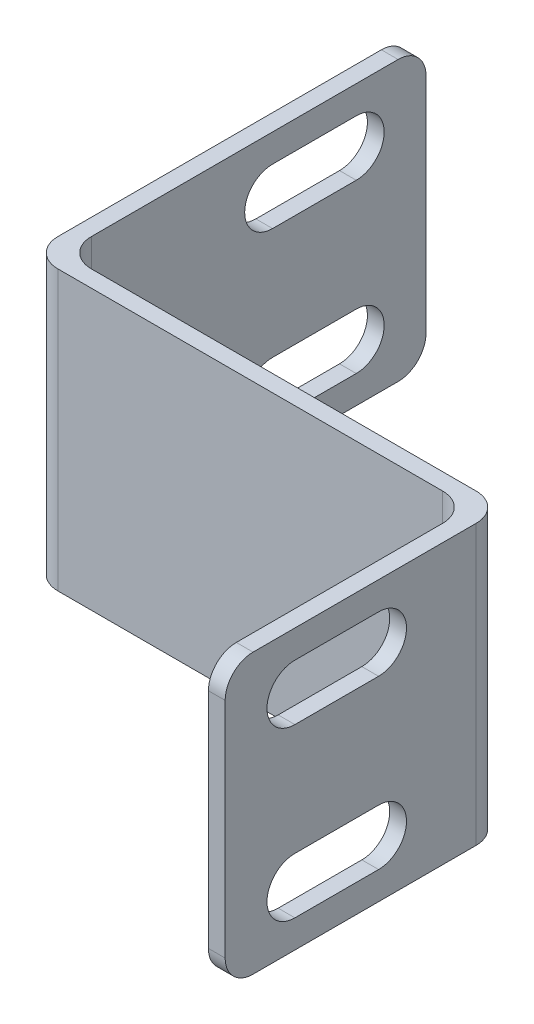
ISO-10303-21;
HEADER;
FILE_DESCRIPTION(('STEP AP214'),'2;1');
FILE_NAME('part.step','',(''),(''),'','','');
FILE_SCHEMA(('AUTOMOTIVE_DESIGN { 1 0 10303 214 1 1 1 1 }'));
ENDSEC;
DATA;
#1=APPLICATION_CONTEXT('core data for automotive mechanical design processes');
#2=APPLICATION_PROTOCOL_DEFINITION('international standard','automotive_design',2000,#1);
#3=PRODUCT_CONTEXT('',#1,'mechanical');
#4=PRODUCT('Part','Part','',(#3));
#5=PRODUCT_RELATED_PRODUCT_CATEGORY('part','',(#4));
#6=PRODUCT_DEFINITION_FORMATION('','',#4);
#7=PRODUCT_DEFINITION_CONTEXT('part definition',#1,'design');
#8=PRODUCT_DEFINITION('design','',#6,#7);
#9=PRODUCT_DEFINITION_SHAPE('','',#8);
#10=(LENGTH_UNIT() NAMED_UNIT(*) SI_UNIT(.MILLI.,.METRE.));
#11=(NAMED_UNIT(*) PLANE_ANGLE_UNIT() SI_UNIT($,.RADIAN.));
#12=(NAMED_UNIT(*) SI_UNIT($,.STERADIAN.) SOLID_ANGLE_UNIT());
#13=UNCERTAINTY_MEASURE_WITH_UNIT(LENGTH_MEASURE(1.E-05),#10,'distance_accuracy_value','');
#14=(GEOMETRIC_REPRESENTATION_CONTEXT(3) GLOBAL_UNCERTAINTY_ASSIGNED_CONTEXT((#13)) GLOBAL_UNIT_ASSIGNED_CONTEXT((#10,
#11,#12)) REPRESENTATION_CONTEXT('',''));
#15=CARTESIAN_POINT('',(0.,0.,0.));
#16=DIRECTION('',(0.,0.,1.));
#17=DIRECTION('',(1.,0.,0.));
#18=AXIS2_PLACEMENT_3D('',#15,#16,#17);
#19=CARTESIAN_POINT('',(0.,50.,0.));
#20=DIRECTION('',(0.,0.,1.));
#21=DIRECTION('',(1.,0.,0.));
#22=AXIS2_PLACEMENT_3D('',#19,#20,#21);
#23=PLANE('',#22);
#24=DIRECTION('',(0.,-1.,0.));
#25=VECTOR('',#24,1.);
#26=CARTESIAN_POINT('',(0.,50.,0.));
#27=LINE('',#26,#25);
#28=CARTESIAN_POINT('',(0.,45.,0.));
#29=VERTEX_POINT('',#28);
#30=CARTESIAN_POINT('',(0.,5.,0.));
#31=VERTEX_POINT('',#30);
#32=EDGE_CURVE('E389',#29,#31,#27,.T.);
#33=ORIENTED_EDGE('',*,*,#32,.T.);
#34=DIRECTION('',(-1.,0.,0.));
#35=VECTOR('',#34,1.);
#36=CARTESIAN_POINT('',(0.,5.,0.));
#37=LINE('',#36,#35);
#38=CARTESIAN_POINT('',(-3.,5.,0.));
#39=VERTEX_POINT('',#38);
#40=EDGE_CURVE('E477',#31,#39,#37,.T.);
#41=ORIENTED_EDGE('',*,*,#40,.T.);
#42=DIRECTION('',(0.,-1.,0.));
#43=VECTOR('',#42,1.);
#44=CARTESIAN_POINT('',(-3.,50.,0.));
#45=LINE('',#44,#43);
#46=CARTESIAN_POINT('',(-3.,45.,0.));
#47=VERTEX_POINT('',#46);
#48=EDGE_CURVE('E410',#47,#39,#45,.T.);
#49=ORIENTED_EDGE('',*,*,#48,.F.);
#50=DIRECTION('',(-1.,0.,0.));
#51=VECTOR('',#50,1.);
#52=CARTESIAN_POINT('',(0.,45.,0.));
#53=LINE('',#52,#51);
#54=EDGE_CURVE('E57',#47,#29,#53,.F.);
#55=ORIENTED_EDGE('',*,*,#54,.T.);
#56=EDGE_LOOP('',(#33,#41,#49,#55));
#57=FACE_BOUND('',#56,.T.);
#58=ADVANCED_FACE('F37',(#57),#23,.F.);
#59=CARTESIAN_POINT('',(-3.,50.,0.));
#60=DIRECTION('',(1.,0.,0.));
#61=DIRECTION('',(0.,0.,-1.));
#62=AXIS2_PLACEMENT_3D('',#59,#60,#61);
#63=PLANE('',#62);
#64=DIRECTION('',(0.,0.,1.));
#65=VECTOR('',#64,1.);
#66=CARTESIAN_POINT('',(-3.,35.,12.5));
#67=LINE('',#66,#65);
#68=CARTESIAN_POINT('',(-3.,35.,12.5));
#69=VERTEX_POINT('',#68);
#70=CARTESIAN_POINT('',(-3.,35.,27.5));
#71=VERTEX_POINT('',#70);
#72=EDGE_CURVE('E262',#69,#71,#67,.T.);
#73=ORIENTED_EDGE('',*,*,#72,.F.);
#74=CARTESIAN_POINT('',(-3.,40.,12.5));
#75=DIRECTION('',(-1.,0.,0.));
#76=DIRECTION('',(0.,0.,1.));
#77=AXIS2_PLACEMENT_3D('',#74,#75,#76);
#78=CIRCLE('',#77,4.99999999999999);
#79=CARTESIAN_POINT('',(-3.,45.,12.5));
#80=VERTEX_POINT('',#79);
#81=EDGE_CURVE('E267',#80,#69,#78,.T.);
#82=ORIENTED_EDGE('',*,*,#81,.F.);
#83=DIRECTION('',(0.,0.,-1.));
#84=VECTOR('',#83,1.);
#85=CARTESIAN_POINT('',(-3.,45.,12.5));
#86=LINE('',#85,#84);
#87=CARTESIAN_POINT('',(-3.,45.,27.5));
#88=VERTEX_POINT('',#87);
#89=EDGE_CURVE('E272',#88,#80,#86,.T.);
#90=ORIENTED_EDGE('',*,*,#89,.F.);
#91=CARTESIAN_POINT('',(-3.,40.,27.5));
#92=DIRECTION('',(-1.,0.,0.));
#93=DIRECTION('',(0.,0.,1.));
#94=AXIS2_PLACEMENT_3D('',#91,#92,#93);
#95=CIRCLE('',#94,4.99999999999999);
#96=EDGE_CURVE('E251',#71,#88,#95,.T.);
#97=ORIENTED_EDGE('',*,*,#96,.F.);
#98=EDGE_LOOP('',(#73,#82,#90,#97));
#99=FACE_BOUND('',#98,.T.);
#100=DIRECTION('',(0.,0.,1.));
#101=VECTOR('',#100,1.);
#102=CARTESIAN_POINT('',(-3.,5.00000000000002,12.5000000000003));
#103=LINE('',#102,#101);
#104=CARTESIAN_POINT('',(-3.,5.00000000000002,12.5000000000003));
#105=VERTEX_POINT('',#104);
#106=CARTESIAN_POINT('',(-3.,5.00000000000002,27.5000000000003));
#107=VERTEX_POINT('',#106);
#108=EDGE_CURVE('E296',#105,#107,#103,.T.);
#109=ORIENTED_EDGE('',*,*,#108,.F.);
#110=CARTESIAN_POINT('',(-3.,10.,12.5000000000003));
#111=DIRECTION('',(-1.,0.,0.));
#112=DIRECTION('',(0.,0.,1.));
#113=AXIS2_PLACEMENT_3D('',#110,#111,#112);
#114=CIRCLE('',#113,4.99999999999999);
#115=CARTESIAN_POINT('',(-3.,15.,12.5000000000003));
#116=VERTEX_POINT('',#115);
#117=EDGE_CURVE('E294',#116,#105,#114,.T.);
#118=ORIENTED_EDGE('',*,*,#117,.F.);
#119=DIRECTION('',(0.,0.,-1.));
#120=VECTOR('',#119,1.);
#121=CARTESIAN_POINT('',(-3.,15.,12.5000000000003));
#122=LINE('',#121,#120);
#123=CARTESIAN_POINT('',(-3.,15.,27.5000000000003));
#124=VERTEX_POINT('',#123);
#125=EDGE_CURVE('E302',#124,#116,#122,.T.);
#126=ORIENTED_EDGE('',*,*,#125,.F.);
#127=CARTESIAN_POINT('',(-3.,10.,27.5000000000003));
#128=DIRECTION('',(-1.,0.,0.));
#129=DIRECTION('',(0.,0.,1.));
#130=AXIS2_PLACEMENT_3D('',#127,#128,#129);
#131=CIRCLE('',#130,4.99999999999999);
#132=EDGE_CURVE('E299',#107,#124,#131,.T.);
#133=ORIENTED_EDGE('',*,*,#132,.F.);
#134=EDGE_LOOP('',(#109,#118,#126,#133));
#135=FACE_BOUND('',#134,.T.);
#136=ORIENTED_EDGE('',*,*,#48,.T.);
#137=CARTESIAN_POINT('',(-3.,5.,5.));
#138=DIRECTION('',(1.,0.,0.));
#139=DIRECTION('',(0.,0.,-1.));
#140=AXIS2_PLACEMENT_3D('',#137,#138,#139);
#141=CIRCLE('',#140,5.);
#142=CARTESIAN_POINT('',(-3.,0.,5.));
#143=VERTEX_POINT('',#142);
#144=EDGE_CURVE('E482',#39,#143,#141,.F.);
#145=ORIENTED_EDGE('',*,*,#144,.T.);
#146=DIRECTION('',(0.,0.,1.));
#147=VECTOR('',#146,1.);
#148=CARTESIAN_POINT('',(-3.,0.,0.));
#149=LINE('',#148,#147);
#150=CARTESIAN_POINT('',(-3.,0.,63.));
#151=VERTEX_POINT('',#150);
#152=EDGE_CURVE('E344',#143,#151,#149,.T.);
#153=ORIENTED_EDGE('',*,*,#152,.T.);
#154=DIRECTION('',(0.,-1.,0.));
#155=VECTOR('',#154,1.);
#156=CARTESIAN_POINT('',(-3.,50.,63.));
#157=LINE('',#156,#155);
#158=CARTESIAN_POINT('',(-3.,50.,63.));
#159=VERTEX_POINT('',#158);
#160=EDGE_CURVE('E439',#151,#159,#157,.F.);
#161=ORIENTED_EDGE('',*,*,#160,.T.);
#162=DIRECTION('',(0.,0.,1.));
#163=VECTOR('',#162,1.);
#164=CARTESIAN_POINT('',(-3.,50.,0.));
#165=LINE('',#164,#163);
#166=CARTESIAN_POINT('',(-3.,50.,5.));
#167=VERTEX_POINT('',#166);
#168=EDGE_CURVE('E372',#167,#159,#165,.T.);
#169=ORIENTED_EDGE('',*,*,#168,.F.);
#170=CARTESIAN_POINT('',(-3.,45.,5.));
#171=DIRECTION('',(1.,0.,0.));
#172=DIRECTION('',(0.,0.,-1.));
#173=AXIS2_PLACEMENT_3D('',#170,#171,#172);
#174=CIRCLE('',#173,5.);
#175=EDGE_CURVE('E480',#167,#47,#174,.F.);
#176=ORIENTED_EDGE('',*,*,#175,.T.);
#177=EDGE_LOOP('',(#136,#145,#153,#161,#169,#176));
#178=FACE_BOUND('',#177,.T.);
#179=ADVANCED_FACE('F269',(#99,#135,#178),#63,.F.);
#180=CARTESIAN_POINT('',(-3.,50.,68.));
#181=DIRECTION('',(0.,0.,-1.));
#182=DIRECTION('',(-1.,0.,0.));
#183=AXIS2_PLACEMENT_3D('',#180,#181,#182);
#184=PLANE('',#183);
#185=DIRECTION('',(1.,0.,0.));
#186=VECTOR('',#185,1.);
#187=CARTESIAN_POINT('',(-3.,0.,68.));
#188=LINE('',#187,#186);
#189=CARTESIAN_POINT('',(2.,0.,68.));
#190=VERTEX_POINT('',#189);
#191=CARTESIAN_POINT('',(71.,0.,68.));
#192=VERTEX_POINT('',#191);
#193=EDGE_CURVE('E391',#190,#192,#188,.T.);
#194=ORIENTED_EDGE('',*,*,#193,.T.);
#195=DIRECTION('',(0.,-1.,0.));
#196=VECTOR('',#195,1.);
#197=CARTESIAN_POINT('',(71.,50.,68.));
#198=LINE('',#197,#196);
#199=CARTESIAN_POINT('',(71.,50.,68.));
#200=VERTEX_POINT('',#199);
#201=EDGE_CURVE('E437',#192,#200,#198,.F.);
#202=ORIENTED_EDGE('',*,*,#201,.T.);
#203=DIRECTION('',(1.,0.,0.));
#204=VECTOR('',#203,1.);
#205=CARTESIAN_POINT('',(-3.,50.,68.));
#206=LINE('',#205,#204);
#207=CARTESIAN_POINT('',(2.,50.,68.));
#208=VERTEX_POINT('',#207);
#209=EDGE_CURVE('E374',#208,#200,#206,.T.);
#210=ORIENTED_EDGE('',*,*,#209,.F.);
#211=DIRECTION('',(0.,-1.,0.));
#212=VECTOR('',#211,1.);
#213=CARTESIAN_POINT('',(2.,50.,68.));
#214=LINE('',#213,#212);
#215=EDGE_CURVE('E434',#208,#190,#214,.T.);
#216=ORIENTED_EDGE('',*,*,#215,.T.);
#217=EDGE_LOOP('',(#194,#202,#210,#216));
#218=FACE_BOUND('',#217,.T.);
#219=ADVANCED_FACE('F512',(#218),#184,.F.);
#220=CARTESIAN_POINT('',(76.,50.,68.));
#221=DIRECTION('',(1.,0.,0.));
#222=DIRECTION('',(0.,0.,-1.));
#223=AXIS2_PLACEMENT_3D('',#220,#221,#222);
#224=PLANE('',#223);
#225=DIRECTION('',(0.,0.,1.));
#226=VECTOR('',#225,1.);
#227=CARTESIAN_POINT('',(76.,35.,87.5));
#228=LINE('',#227,#226);
#229=CARTESIAN_POINT('',(76.,35.,87.5));
#230=VERTEX_POINT('',#229);
#231=CARTESIAN_POINT('',(76.,35.,102.5));
#232=VERTEX_POINT('',#231);
#233=EDGE_CURVE('E325',#230,#232,#228,.T.);
#234=ORIENTED_EDGE('',*,*,#233,.F.);
#235=CARTESIAN_POINT('',(76.,40.,87.5));
#236=DIRECTION('',(-1.,0.,0.));
#237=DIRECTION('',(0.,0.,1.));
#238=AXIS2_PLACEMENT_3D('',#235,#236,#237);
#239=CIRCLE('',#238,5.);
#240=CARTESIAN_POINT('',(76.,45.,87.5));
#241=VERTEX_POINT('',#240);
#242=EDGE_CURVE('E323',#241,#230,#239,.T.);
#243=ORIENTED_EDGE('',*,*,#242,.F.);
#244=DIRECTION('',(0.,0.,-1.));
#245=VECTOR('',#244,1.);
#246=CARTESIAN_POINT('',(76.,45.,87.5));
#247=LINE('',#246,#245);
#248=CARTESIAN_POINT('',(76.,45.,102.5));
#249=VERTEX_POINT('',#248);
#250=EDGE_CURVE('E332',#249,#241,#247,.T.);
#251=ORIENTED_EDGE('',*,*,#250,.F.);
#252=CARTESIAN_POINT('',(76.,40.,102.5));
#253=DIRECTION('',(-1.,0.,0.));
#254=DIRECTION('',(0.,0.,1.));
#255=AXIS2_PLACEMENT_3D('',#252,#253,#254);
#256=CIRCLE('',#255,5.);
#257=EDGE_CURVE('E329',#232,#249,#256,.T.);
#258=ORIENTED_EDGE('',*,*,#257,.F.);
#259=EDGE_LOOP('',(#234,#243,#251,#258));
#260=FACE_BOUND('',#259,.T.);
#261=DIRECTION('',(0.,0.,1.));
#262=VECTOR('',#261,1.);
#263=CARTESIAN_POINT('',(76.,5.00000000000001,87.5000000000003));
#264=LINE('',#263,#262);
#265=CARTESIAN_POINT('',(76.,5.00000000000001,87.5000000000003));
#266=VERTEX_POINT('',#265);
#267=CARTESIAN_POINT('',(76.,5.00000000000001,102.5));
#268=VERTEX_POINT('',#267);
#269=EDGE_CURVE('E354',#266,#268,#264,.T.);
#270=ORIENTED_EDGE('',*,*,#269,.F.);
#271=CARTESIAN_POINT('',(76.,10.,87.5000000000003));
#272=DIRECTION('',(-1.,0.,0.));
#273=DIRECTION('',(0.,0.,1.));
#274=AXIS2_PLACEMENT_3D('',#271,#272,#273);
#275=CIRCLE('',#274,5.);
#276=CARTESIAN_POINT('',(76.,15.,87.5000000000003));
#277=VERTEX_POINT('',#276);
#278=EDGE_CURVE('E283',#277,#266,#275,.T.);
#279=ORIENTED_EDGE('',*,*,#278,.F.);
#280=DIRECTION('',(0.,0.,-1.));
#281=VECTOR('',#280,1.);
#282=CARTESIAN_POINT('',(76.,15.,87.5000000000003));
#283=LINE('',#282,#281);
#284=CARTESIAN_POINT('',(76.,15.,102.5));
#285=VERTEX_POINT('',#284);
#286=EDGE_CURVE('E360',#285,#277,#283,.T.);
#287=ORIENTED_EDGE('',*,*,#286,.F.);
#288=CARTESIAN_POINT('',(76.,10.,102.5));
#289=DIRECTION('',(-1.,0.,0.));
#290=DIRECTION('',(0.,0.,1.));
#291=AXIS2_PLACEMENT_3D('',#288,#289,#290);
#292=CIRCLE('',#291,5.);
#293=EDGE_CURVE('E357',#268,#285,#292,.T.);
#294=ORIENTED_EDGE('',*,*,#293,.F.);
#295=EDGE_LOOP('',(#270,#279,#287,#294));
#296=FACE_BOUND('',#295,.T.);
#297=DIRECTION('',(0.,0.,1.));
#298=VECTOR('',#297,1.);
#299=CARTESIAN_POINT('',(76.,0.,68.));
#300=LINE('',#299,#298);
#301=CARTESIAN_POINT('',(76.,0.,73.));
#302=VERTEX_POINT('',#301);
#303=CARTESIAN_POINT('',(76.,0.,110.));
#304=VERTEX_POINT('',#303);
#305=EDGE_CURVE('E394',#302,#304,#300,.T.);
#306=ORIENTED_EDGE('',*,*,#305,.T.);
#307=CARTESIAN_POINT('',(76.,5.,110.));
#308=DIRECTION('',(1.,0.,0.));
#309=DIRECTION('',(0.,0.,-1.));
#310=AXIS2_PLACEMENT_3D('',#307,#308,#309);
#311=CIRCLE('',#310,5.);
#312=CARTESIAN_POINT('',(76.,5.,115.));
#313=VERTEX_POINT('',#312);
#314=EDGE_CURVE('E468',#304,#313,#311,.F.);
#315=ORIENTED_EDGE('',*,*,#314,.T.);
#316=DIRECTION('',(0.,-1.,0.));
#317=VECTOR('',#316,1.);
#318=CARTESIAN_POINT('',(76.,50.,115.));
#319=LINE('',#318,#317);
#320=CARTESIAN_POINT('',(76.,45.,115.));
#321=VERTEX_POINT('',#320);
#322=EDGE_CURVE('E407',#321,#313,#319,.T.);
#323=ORIENTED_EDGE('',*,*,#322,.F.);
#324=CARTESIAN_POINT('',(76.,45.,110.));
#325=DIRECTION('',(1.,0.,0.));
#326=DIRECTION('',(0.,0.,-1.));
#327=AXIS2_PLACEMENT_3D('',#324,#325,#326);
#328=CIRCLE('',#327,5.);
#329=CARTESIAN_POINT('',(76.,50.,110.));
#330=VERTEX_POINT('',#329);
#331=EDGE_CURVE('E466',#321,#330,#328,.F.);
#332=ORIENTED_EDGE('',*,*,#331,.T.);
#333=DIRECTION('',(0.,0.,1.));
#334=VECTOR('',#333,1.);
#335=CARTESIAN_POINT('',(76.,50.,68.));
#336=LINE('',#335,#334);
#337=CARTESIAN_POINT('',(76.,50.,73.));
#338=VERTEX_POINT('',#337);
#339=EDGE_CURVE('E378',#338,#330,#336,.T.);
#340=ORIENTED_EDGE('',*,*,#339,.F.);
#341=DIRECTION('',(0.,-1.,0.));
#342=VECTOR('',#341,1.);
#343=CARTESIAN_POINT('',(76.,0.,73.));
#344=LINE('',#343,#342);
#345=EDGE_CURVE('E431',#338,#302,#344,.T.);
#346=ORIENTED_EDGE('',*,*,#345,.T.);
#347=EDGE_LOOP('',(#306,#315,#323,#332,#340,#346));
#348=FACE_BOUND('',#347,.T.);
#349=ADVANCED_FACE('F520',(#260,#296,#348),#224,.F.);
#350=CARTESIAN_POINT('',(76.,50.,115.));
#351=DIRECTION('',(0.,0.,-1.));
#352=DIRECTION('',(-1.,0.,0.));
#353=AXIS2_PLACEMENT_3D('',#350,#351,#352);
#354=PLANE('',#353);
#355=ORIENTED_EDGE('',*,*,#322,.T.);
#356=DIRECTION('',(1.,0.,0.));
#357=VECTOR('',#356,1.);
#358=CARTESIAN_POINT('',(76.,5.,115.));
#359=LINE('',#358,#357);
#360=CARTESIAN_POINT('',(79.,5.,115.));
#361=VERTEX_POINT('',#360);
#362=EDGE_CURVE('E455',#313,#361,#359,.T.);
#363=ORIENTED_EDGE('',*,*,#362,.T.);
#364=DIRECTION('',(0.,-1.,0.));
#365=VECTOR('',#364,1.);
#366=CARTESIAN_POINT('',(79.,50.,115.));
#367=LINE('',#366,#365);
#368=CARTESIAN_POINT('',(79.,45.,115.));
#369=VERTEX_POINT('',#368);
#370=EDGE_CURVE('E404',#369,#361,#367,.T.);
#371=ORIENTED_EDGE('',*,*,#370,.F.);
#372=DIRECTION('',(1.,0.,0.));
#373=VECTOR('',#372,1.);
#374=CARTESIAN_POINT('',(76.,45.,115.));
#375=LINE('',#374,#373);
#376=EDGE_CURVE('E453',#369,#321,#375,.F.);
#377=ORIENTED_EDGE('',*,*,#376,.T.);
#378=EDGE_LOOP('',(#355,#363,#371,#377));
#379=FACE_BOUND('',#378,.T.);
#380=ADVANCED_FACE('F549',(#379),#354,.F.);
#381=CARTESIAN_POINT('',(79.,50.,65.));
#382=DIRECTION('',(-1.,0.,0.));
#383=DIRECTION('',(0.,0.,1.));
#384=AXIS2_PLACEMENT_3D('',#381,#382,#383);
#385=PLANE('',#384);
#386=DIRECTION('',(0.,0.,1.));
#387=VECTOR('',#386,1.);
#388=CARTESIAN_POINT('',(79.,45.,87.5));
#389=LINE('',#388,#387);
#390=CARTESIAN_POINT('',(79.,45.,87.5));
#391=VERTEX_POINT('',#390);
#392=CARTESIAN_POINT('',(79.,45.,102.5));
#393=VERTEX_POINT('',#392);
#394=EDGE_CURVE('E317',#391,#393,#389,.T.);
#395=ORIENTED_EDGE('',*,*,#394,.F.);
#396=CARTESIAN_POINT('',(79.,40.,87.5));
#397=DIRECTION('',(-1.,0.,0.));
#398=DIRECTION('',(0.,0.,1.));
#399=AXIS2_PLACEMENT_3D('',#396,#397,#398);
#400=CIRCLE('',#399,5.);
#401=CARTESIAN_POINT('',(79.,35.,87.5));
#402=VERTEX_POINT('',#401);
#403=EDGE_CURVE('E320',#402,#391,#400,.F.);
#404=ORIENTED_EDGE('',*,*,#403,.F.);
#405=DIRECTION('',(0.,0.,-1.));
#406=VECTOR('',#405,1.);
#407=CARTESIAN_POINT('',(79.,35.,87.5));
#408=LINE('',#407,#406);
#409=CARTESIAN_POINT('',(79.,35.,102.5));
#410=VERTEX_POINT('',#409);
#411=EDGE_CURVE('E322',#410,#402,#408,.T.);
#412=ORIENTED_EDGE('',*,*,#411,.F.);
#413=CARTESIAN_POINT('',(79.,40.,102.5));
#414=DIRECTION('',(-1.,0.,0.));
#415=DIRECTION('',(0.,0.,1.));
#416=AXIS2_PLACEMENT_3D('',#413,#414,#415);
#417=CIRCLE('',#416,5.);
#418=EDGE_CURVE('E314',#393,#410,#417,.F.);
#419=ORIENTED_EDGE('',*,*,#418,.F.);
#420=EDGE_LOOP('',(#395,#404,#412,#419));
#421=FACE_BOUND('',#420,.T.);
#422=DIRECTION('',(0.,0.,1.));
#423=VECTOR('',#422,1.);
#424=CARTESIAN_POINT('',(79.,15.,87.5000000000003));
#425=LINE('',#424,#423);
#426=CARTESIAN_POINT('',(79.,15.,87.5000000000003));
#427=VERTEX_POINT('',#426);
#428=CARTESIAN_POINT('',(79.,15.,102.5));
#429=VERTEX_POINT('',#428);
#430=EDGE_CURVE('E348',#427,#429,#425,.T.);
#431=ORIENTED_EDGE('',*,*,#430,.F.);
#432=CARTESIAN_POINT('',(79.,10.,87.5000000000003));
#433=DIRECTION('',(-1.,0.,0.));
#434=DIRECTION('',(0.,0.,1.));
#435=AXIS2_PLACEMENT_3D('',#432,#433,#434);
#436=CIRCLE('',#435,5.);
#437=CARTESIAN_POINT('',(79.,5.00000000000001,87.5000000000003));
#438=VERTEX_POINT('',#437);
#439=EDGE_CURVE('E351',#438,#427,#436,.F.);
#440=ORIENTED_EDGE('',*,*,#439,.F.);
#441=DIRECTION('',(0.,0.,-1.));
#442=VECTOR('',#441,1.);
#443=CARTESIAN_POINT('',(79.,5.00000000000001,87.5000000000003));
#444=LINE('',#443,#442);
#445=CARTESIAN_POINT('',(79.,5.00000000000001,102.5));
#446=VERTEX_POINT('',#445);
#447=EDGE_CURVE('E326',#446,#438,#444,.T.);
#448=ORIENTED_EDGE('',*,*,#447,.F.);
#449=CARTESIAN_POINT('',(79.,10.,102.5));
#450=DIRECTION('',(-1.,0.,0.));
#451=DIRECTION('',(0.,0.,1.));
#452=AXIS2_PLACEMENT_3D('',#449,#450,#451);
#453=CIRCLE('',#452,5.);
#454=EDGE_CURVE('E345',#429,#446,#453,.F.);
#455=ORIENTED_EDGE('',*,*,#454,.F.);
#456=EDGE_LOOP('',(#431,#440,#448,#455));
#457=FACE_BOUND('',#456,.T.);
#458=ORIENTED_EDGE('',*,*,#370,.T.);
#459=CARTESIAN_POINT('',(79.,5.,110.));
#460=DIRECTION('',(-1.,0.,0.));
#461=DIRECTION('',(0.,0.,1.));
#462=AXIS2_PLACEMENT_3D('',#459,#460,#461);
#463=CIRCLE('',#462,5.);
#464=CARTESIAN_POINT('',(79.,0.,110.));
#465=VERTEX_POINT('',#464);
#466=EDGE_CURVE('E460',#361,#465,#463,.F.);
#467=ORIENTED_EDGE('',*,*,#466,.T.);
#468=DIRECTION('',(0.,0.,-1.));
#469=VECTOR('',#468,1.);
#470=CARTESIAN_POINT('',(79.,0.,65.));
#471=LINE('',#470,#469);
#472=CARTESIAN_POINT('',(79.,0.,70.));
#473=VERTEX_POINT('',#472);
#474=EDGE_CURVE('E397',#465,#473,#471,.T.);
#475=ORIENTED_EDGE('',*,*,#474,.T.);
#476=DIRECTION('',(0.,-1.,0.));
#477=VECTOR('',#476,1.);
#478=CARTESIAN_POINT('',(79.,50.,70.));
#479=LINE('',#478,#477);
#480=CARTESIAN_POINT('',(79.,50.,70.));
#481=VERTEX_POINT('',#480);
#482=EDGE_CURVE('E424',#473,#481,#479,.F.);
#483=ORIENTED_EDGE('',*,*,#482,.T.);
#484=DIRECTION('',(0.,0.,-1.));
#485=VECTOR('',#484,1.);
#486=CARTESIAN_POINT('',(79.,50.,65.));
#487=LINE('',#486,#485);
#488=CARTESIAN_POINT('',(79.,50.,110.));
#489=VERTEX_POINT('',#488);
#490=EDGE_CURVE('E381',#489,#481,#487,.T.);
#491=ORIENTED_EDGE('',*,*,#490,.F.);
#492=CARTESIAN_POINT('',(79.,45.,110.));
#493=DIRECTION('',(-1.,0.,0.));
#494=DIRECTION('',(0.,0.,1.));
#495=AXIS2_PLACEMENT_3D('',#492,#493,#494);
#496=CIRCLE('',#495,5.);
#497=EDGE_CURVE('E458',#489,#369,#496,.F.);
#498=ORIENTED_EDGE('',*,*,#497,.T.);
#499=EDGE_LOOP('',(#458,#467,#475,#483,#491,#498));
#500=FACE_BOUND('',#499,.T.);
#501=ADVANCED_FACE('F529',(#421,#457,#500),#385,.F.);
#502=CARTESIAN_POINT('',(0.,50.,65.));
#503=DIRECTION('',(0.,0.,1.));
#504=DIRECTION('',(1.,0.,0.));
#505=AXIS2_PLACEMENT_3D('',#502,#503,#504);
#506=PLANE('',#505);
#507=DIRECTION('',(-1.,0.,0.));
#508=VECTOR('',#507,1.);
#509=CARTESIAN_POINT('',(0.,50.,65.));
#510=LINE('',#509,#508);
#511=CARTESIAN_POINT('',(74.,50.,65.));
#512=VERTEX_POINT('',#511);
#513=CARTESIAN_POINT('',(5.00000000000001,50.,65.));
#514=VERTEX_POINT('',#513);
#515=EDGE_CURVE('E383',#512,#514,#510,.T.);
#516=ORIENTED_EDGE('',*,*,#515,.F.);
#517=DIRECTION('',(0.,-1.,0.));
#518=VECTOR('',#517,1.);
#519=CARTESIAN_POINT('',(74.,50.,65.));
#520=LINE('',#519,#518);
#521=CARTESIAN_POINT('',(74.,0.,65.));
#522=VERTEX_POINT('',#521);
#523=EDGE_CURVE('E415',#512,#522,#520,.T.);
#524=ORIENTED_EDGE('',*,*,#523,.T.);
#525=DIRECTION('',(-1.,0.,0.));
#526=VECTOR('',#525,1.);
#527=CARTESIAN_POINT('',(0.,0.,65.));
#528=LINE('',#527,#526);
#529=CARTESIAN_POINT('',(5.00000000000001,0.,65.));
#530=VERTEX_POINT('',#529);
#531=EDGE_CURVE('E399',#522,#530,#528,.T.);
#532=ORIENTED_EDGE('',*,*,#531,.T.);
#533=DIRECTION('',(0.,-1.,0.));
#534=VECTOR('',#533,1.);
#535=CARTESIAN_POINT('',(5.00000000000001,50.,65.));
#536=LINE('',#535,#534);
#537=EDGE_CURVE('E413',#530,#514,#536,.F.);
#538=ORIENTED_EDGE('',*,*,#537,.T.);
#539=EDGE_LOOP('',(#516,#524,#532,#538));
#540=FACE_BOUND('',#539,.T.);
#541=ADVANCED_FACE('F538',(#540),#506,.F.);
#542=CARTESIAN_POINT('',(0.,50.,0.));
#543=DIRECTION('',(-1.,0.,0.));
#544=DIRECTION('',(0.,0.,1.));
#545=AXIS2_PLACEMENT_3D('',#542,#543,#544);
#546=PLANE('',#545);
#547=DIRECTION('',(0.,0.,1.));
#548=VECTOR('',#547,1.);
#549=CARTESIAN_POINT('',(0.,45.,12.5));
#550=LINE('',#549,#548);
#551=CARTESIAN_POINT('',(0.,45.,12.5));
#552=VERTEX_POINT('',#551);
#553=CARTESIAN_POINT('',(0.,45.,27.5));
#554=VERTEX_POINT('',#553);
#555=EDGE_CURVE('E890',#552,#554,#550,.T.);
#556=ORIENTED_EDGE('',*,*,#555,.F.);
#557=CARTESIAN_POINT('',(0.,40.,12.5));
#558=DIRECTION('',(-1.,0.,0.));
#559=DIRECTION('',(0.,0.,1.));
#560=AXIS2_PLACEMENT_3D('',#557,#558,#559);
#561=CIRCLE('',#560,4.99999999999999);
#562=CARTESIAN_POINT('',(0.,35.,12.5));
#563=VERTEX_POINT('',#562);
#564=EDGE_CURVE('E284',#563,#552,#561,.F.);
#565=ORIENTED_EDGE('',*,*,#564,.F.);
#566=DIRECTION('',(0.,0.,-1.));
#567=VECTOR('',#566,1.);
#568=CARTESIAN_POINT('',(0.,35.,12.5));
#569=LINE('',#568,#567);
#570=CARTESIAN_POINT('',(0.,35.,27.5));
#571=VERTEX_POINT('',#570);
#572=EDGE_CURVE('E281',#571,#563,#569,.T.);
#573=ORIENTED_EDGE('',*,*,#572,.F.);
#574=CARTESIAN_POINT('',(0.,40.,27.5));
#575=DIRECTION('',(-1.,0.,0.));
#576=DIRECTION('',(0.,0.,1.));
#577=AXIS2_PLACEMENT_3D('',#574,#575,#576);
#578=CIRCLE('',#577,4.99999999999999);
#579=EDGE_CURVE('E254',#554,#571,#578,.F.);
#580=ORIENTED_EDGE('',*,*,#579,.F.);
#581=EDGE_LOOP('',(#556,#565,#573,#580));
#582=FACE_BOUND('',#581,.T.);
#583=DIRECTION('',(0.,0.,1.));
#584=VECTOR('',#583,1.);
#585=CARTESIAN_POINT('',(0.,15.,12.5000000000003));
#586=LINE('',#585,#584);
#587=CARTESIAN_POINT('',(0.,15.,12.5000000000003));
#588=VERTEX_POINT('',#587);
#589=CARTESIAN_POINT('',(0.,15.,27.5000000000003));
#590=VERTEX_POINT('',#589);
#591=EDGE_CURVE('E288',#588,#590,#586,.T.);
#592=ORIENTED_EDGE('',*,*,#591,.F.);
#593=CARTESIAN_POINT('',(0.,10.,12.5000000000003));
#594=DIRECTION('',(-1.,0.,0.));
#595=DIRECTION('',(0.,0.,1.));
#596=AXIS2_PLACEMENT_3D('',#593,#594,#595);
#597=CIRCLE('',#596,4.99999999999999);
#598=CARTESIAN_POINT('',(0.,5.00000000000002,12.5000000000003));
#599=VERTEX_POINT('',#598);
#600=EDGE_CURVE('E291',#599,#588,#597,.F.);
#601=ORIENTED_EDGE('',*,*,#600,.F.);
#602=DIRECTION('',(0.,0.,-1.));
#603=VECTOR('',#602,1.);
#604=CARTESIAN_POINT('',(0.,5.00000000000002,12.5000000000003));
#605=LINE('',#604,#603);
#606=CARTESIAN_POINT('',(0.,5.00000000000002,27.5000000000003));
#607=VERTEX_POINT('',#606);
#608=EDGE_CURVE('E293',#607,#599,#605,.T.);
#609=ORIENTED_EDGE('',*,*,#608,.F.);
#610=CARTESIAN_POINT('',(0.,10.,27.5000000000003));
#611=DIRECTION('',(-1.,0.,0.));
#612=DIRECTION('',(0.,0.,1.));
#613=AXIS2_PLACEMENT_3D('',#610,#611,#612);
#614=CIRCLE('',#613,4.99999999999999);
#615=EDGE_CURVE('E285',#590,#607,#614,.F.);
#616=ORIENTED_EDGE('',*,*,#615,.F.);
#617=EDGE_LOOP('',(#592,#601,#609,#616));
#618=FACE_BOUND('',#617,.T.);
#619=DIRECTION('',(0.,0.,-1.));
#620=VECTOR('',#619,1.);
#621=CARTESIAN_POINT('',(0.,0.,0.));
#622=LINE('',#621,#620);
#623=CARTESIAN_POINT('',(0.,0.,60.));
#624=VERTEX_POINT('',#623);
#625=CARTESIAN_POINT('',(0.,0.,5.));
#626=VERTEX_POINT('',#625);
#627=EDGE_CURVE('E375',#624,#626,#622,.T.);
#628=ORIENTED_EDGE('',*,*,#627,.T.);
#629=CARTESIAN_POINT('',(0.,5.,5.));
#630=DIRECTION('',(-1.,0.,0.));
#631=DIRECTION('',(0.,0.,1.));
#632=AXIS2_PLACEMENT_3D('',#629,#630,#631);
#633=CIRCLE('',#632,5.);
#634=EDGE_CURVE('E11',#626,#31,#633,.F.);
#635=ORIENTED_EDGE('',*,*,#634,.T.);
#636=ORIENTED_EDGE('',*,*,#32,.F.);
#637=CARTESIAN_POINT('',(0.,45.,5.));
#638=DIRECTION('',(-1.,0.,0.));
#639=DIRECTION('',(0.,0.,1.));
#640=AXIS2_PLACEMENT_3D('',#637,#638,#639);
#641=CIRCLE('',#640,5.);
#642=CARTESIAN_POINT('',(0.,50.,5.));
#643=VERTEX_POINT('',#642);
#644=EDGE_CURVE('E45',#29,#643,#641,.F.);
#645=ORIENTED_EDGE('',*,*,#644,.T.);
#646=DIRECTION('',(0.,0.,-1.));
#647=VECTOR('',#646,1.);
#648=CARTESIAN_POINT('',(0.,50.,0.));
#649=LINE('',#648,#647);
#650=CARTESIAN_POINT('',(0.,50.,60.));
#651=VERTEX_POINT('',#650);
#652=EDGE_CURVE('E386',#651,#643,#649,.T.);
#653=ORIENTED_EDGE('',*,*,#652,.F.);
#654=DIRECTION('',(0.,-1.,0.));
#655=VECTOR('',#654,1.);
#656=CARTESIAN_POINT('',(0.,0.,60.));
#657=LINE('',#656,#655);
#658=EDGE_CURVE('E442',#651,#624,#657,.T.);
#659=ORIENTED_EDGE('',*,*,#658,.T.);
#660=EDGE_LOOP('',(#628,#635,#636,#645,#653,#659));
#661=FACE_BOUND('',#660,.T.);
#662=ADVANCED_FACE('F485',(#582,#618,#661),#546,.F.);
#663=CARTESIAN_POINT('',(0.,50.,0.));
#664=DIRECTION('',(0.,1.,0.));
#665=DIRECTION('',(0.,0.,1.));
#666=AXIS2_PLACEMENT_3D('',#663,#664,#665);
#667=PLANE('',#666);
#668=ORIENTED_EDGE('',*,*,#339,.T.);
#669=DIRECTION('',(1.,0.,0.));
#670=VECTOR('',#669,1.);
#671=CARTESIAN_POINT('',(79.,50.,110.));
#672=LINE('',#671,#670);
#673=EDGE_CURVE('E473',#330,#489,#672,.T.);
#674=ORIENTED_EDGE('',*,*,#673,.T.);
#675=ORIENTED_EDGE('',*,*,#490,.T.);
#676=CARTESIAN_POINT('',(74.,50.,70.));
#677=DIRECTION('',(0.,1.,0.));
#678=DIRECTION('',(0.,0.,1.));
#679=AXIS2_PLACEMENT_3D('',#676,#677,#678);
#680=CIRCLE('',#679,5.);
#681=EDGE_CURVE('E429',#481,#512,#680,.T.);
#682=ORIENTED_EDGE('',*,*,#681,.T.);
#683=ORIENTED_EDGE('',*,*,#515,.T.);
#684=CARTESIAN_POINT('',(5.00000000000001,50.,60.));
#685=DIRECTION('',(0.,1.,0.));
#686=DIRECTION('',(0.,0.,1.));
#687=AXIS2_PLACEMENT_3D('',#684,#685,#686);
#688=CIRCLE('',#687,5.);
#689=EDGE_CURVE('E451',#514,#651,#688,.F.);
#690=ORIENTED_EDGE('',*,*,#689,.T.);
#691=ORIENTED_EDGE('',*,*,#652,.T.);
#692=DIRECTION('',(-1.,0.,0.));
#693=VECTOR('',#692,1.);
#694=CARTESIAN_POINT('',(-3.,50.,5.));
#695=LINE('',#694,#693);
#696=EDGE_CURVE('E470',#643,#167,#695,.T.);
#697=ORIENTED_EDGE('',*,*,#696,.T.);
#698=ORIENTED_EDGE('',*,*,#168,.T.);
#699=CARTESIAN_POINT('',(2.,50.,63.));
#700=DIRECTION('',(0.,1.,0.));
#701=DIRECTION('',(0.,0.,1.));
#702=AXIS2_PLACEMENT_3D('',#699,#700,#701);
#703=CIRCLE('',#702,5.);
#704=EDGE_CURVE('E427',#159,#208,#703,.T.);
#705=ORIENTED_EDGE('',*,*,#704,.T.);
#706=ORIENTED_EDGE('',*,*,#209,.T.);
#707=CARTESIAN_POINT('',(71.,50.,73.));
#708=DIRECTION('',(0.,1.,0.));
#709=DIRECTION('',(0.,0.,1.));
#710=AXIS2_PLACEMENT_3D('',#707,#708,#709);
#711=CIRCLE('',#710,5.);
#712=EDGE_CURVE('E447',#200,#338,#711,.F.);
#713=ORIENTED_EDGE('',*,*,#712,.T.);
#714=EDGE_LOOP('',(#668,#674,#675,#682,#683,#690,#691,#697,#698,#705,#706,#713));
#715=FACE_BOUND('',#714,.T.);
#716=ADVANCED_FACE('F490',(#715),#667,.T.);
#717=CARTESIAN_POINT('',(0.,0.,0.));
#718=DIRECTION('',(0.,1.,0.));
#719=DIRECTION('',(0.,0.,1.));
#720=AXIS2_PLACEMENT_3D('',#717,#718,#719);
#721=PLANE('',#720);
#722=ORIENTED_EDGE('',*,*,#474,.F.);
#723=DIRECTION('',(1.,0.,0.));
#724=VECTOR('',#723,1.);
#725=CARTESIAN_POINT('',(0.,0.,110.));
#726=LINE('',#725,#724);
#727=EDGE_CURVE('E464',#465,#304,#726,.F.);
#728=ORIENTED_EDGE('',*,*,#727,.T.);
#729=ORIENTED_EDGE('',*,*,#305,.F.);
#730=CARTESIAN_POINT('',(71.,0.,73.));
#731=DIRECTION('',(0.,1.,0.));
#732=DIRECTION('',(0.,0.,1.));
#733=AXIS2_PLACEMENT_3D('',#730,#731,#732);
#734=CIRCLE('',#733,5.);
#735=EDGE_CURVE('E445',#302,#192,#734,.T.);
#736=ORIENTED_EDGE('',*,*,#735,.T.);
#737=ORIENTED_EDGE('',*,*,#193,.F.);
#738=CARTESIAN_POINT('',(2.,0.,63.));
#739=DIRECTION('',(0.,1.,0.));
#740=DIRECTION('',(0.,0.,1.));
#741=AXIS2_PLACEMENT_3D('',#738,#739,#740);
#742=CIRCLE('',#741,5.);
#743=EDGE_CURVE('E418',#190,#151,#742,.F.);
#744=ORIENTED_EDGE('',*,*,#743,.T.);
#745=ORIENTED_EDGE('',*,*,#152,.F.);
#746=DIRECTION('',(-1.,0.,0.));
#747=VECTOR('',#746,1.);
#748=CARTESIAN_POINT('',(0.,0.,5.));
#749=LINE('',#748,#747);
#750=EDGE_CURVE('E462',#143,#626,#749,.F.);
#751=ORIENTED_EDGE('',*,*,#750,.T.);
#752=ORIENTED_EDGE('',*,*,#627,.F.);
#753=CARTESIAN_POINT('',(5.00000000000001,0.,60.));
#754=DIRECTION('',(0.,1.,0.));
#755=DIRECTION('',(0.,0.,1.));
#756=AXIS2_PLACEMENT_3D('',#753,#754,#755);
#757=CIRCLE('',#756,5.);
#758=EDGE_CURVE('E449',#624,#530,#757,.T.);
#759=ORIENTED_EDGE('',*,*,#758,.T.);
#760=ORIENTED_EDGE('',*,*,#531,.F.);
#761=CARTESIAN_POINT('',(74.,0.,70.));
#762=DIRECTION('',(0.,1.,0.));
#763=DIRECTION('',(0.,0.,1.));
#764=AXIS2_PLACEMENT_3D('',#761,#762,#763);
#765=CIRCLE('',#764,5.);
#766=EDGE_CURVE('E421',#522,#473,#765,.F.);
#767=ORIENTED_EDGE('',*,*,#766,.T.);
#768=EDGE_LOOP('',(#722,#728,#729,#736,#737,#744,#745,#751,#752,#759,#760,#767));
#769=FACE_BOUND('',#768,.T.);
#770=ADVANCED_FACE('F501',(#769),#721,.F.);
#771=CARTESIAN_POINT('',(74.,50.,70.));
#772=DIRECTION('',(0.,-1.,0.));
#773=DIRECTION('',(0.,0.,-1.));
#774=AXIS2_PLACEMENT_3D('',#771,#772,#773);
#775=CYLINDRICAL_SURFACE('',#774,5.);
#776=ORIENTED_EDGE('',*,*,#681,.F.);
#777=ORIENTED_EDGE('',*,*,#482,.F.);
#778=ORIENTED_EDGE('',*,*,#766,.F.);
#779=ORIENTED_EDGE('',*,*,#523,.F.);
#780=EDGE_LOOP('',(#776,#777,#778,#779));
#781=FACE_BOUND('',#780,.T.);
#782=ADVANCED_FACE('F535',(#781),#775,.T.);
#783=CARTESIAN_POINT('',(71.,50.,73.));
#784=DIRECTION('',(0.,1.,0.));
#785=DIRECTION('',(0.,0.,1.));
#786=AXIS2_PLACEMENT_3D('',#783,#784,#785);
#787=CYLINDRICAL_SURFACE('',#786,5.);
#788=ORIENTED_EDGE('',*,*,#712,.F.);
#789=ORIENTED_EDGE('',*,*,#201,.F.);
#790=ORIENTED_EDGE('',*,*,#735,.F.);
#791=ORIENTED_EDGE('',*,*,#345,.F.);
#792=EDGE_LOOP('',(#788,#789,#790,#791));
#793=FACE_BOUND('',#792,.T.);
#794=ADVANCED_FACE('F515',(#793),#787,.F.);
#795=CARTESIAN_POINT('',(2.,50.,63.));
#796=DIRECTION('',(0.,-1.,0.));
#797=DIRECTION('',(0.,0.,-1.));
#798=AXIS2_PLACEMENT_3D('',#795,#796,#797);
#799=CYLINDRICAL_SURFACE('',#798,5.);
#800=ORIENTED_EDGE('',*,*,#704,.F.);
#801=ORIENTED_EDGE('',*,*,#160,.F.);
#802=ORIENTED_EDGE('',*,*,#743,.F.);
#803=ORIENTED_EDGE('',*,*,#215,.F.);
#804=EDGE_LOOP('',(#800,#801,#802,#803));
#805=FACE_BOUND('',#804,.T.);
#806=ADVANCED_FACE('F508',(#805),#799,.T.);
#807=CARTESIAN_POINT('',(5.00000000000001,50.,60.));
#808=DIRECTION('',(0.,1.,0.));
#809=DIRECTION('',(0.,0.,1.));
#810=AXIS2_PLACEMENT_3D('',#807,#808,#809);
#811=CYLINDRICAL_SURFACE('',#810,5.);
#812=ORIENTED_EDGE('',*,*,#689,.F.);
#813=ORIENTED_EDGE('',*,*,#537,.F.);
#814=ORIENTED_EDGE('',*,*,#758,.F.);
#815=ORIENTED_EDGE('',*,*,#658,.F.);
#816=EDGE_LOOP('',(#812,#813,#814,#815));
#817=FACE_BOUND('',#816,.T.);
#818=ADVANCED_FACE('F542',(#817),#811,.F.);
#819=CARTESIAN_POINT('',(105.925824035673,10.,87.5000000000003));
#820=DIRECTION('',(-1.,0.,0.));
#821=DIRECTION('',(0.,0.,1.));
#822=AXIS2_PLACEMENT_3D('',#819,#820,#821);
#823=CYLINDRICAL_SURFACE('',#822,5.);
#824=ORIENTED_EDGE('',*,*,#439,.T.);
#825=DIRECTION('',(-1.,0.,0.));
#826=VECTOR('',#825,1.);
#827=CARTESIAN_POINT('',(105.925824035673,15.,87.5000000000003));
#828=LINE('',#827,#826);
#829=EDGE_CURVE('E349',#427,#277,#828,.T.);
#830=ORIENTED_EDGE('',*,*,#829,.T.);
#831=ORIENTED_EDGE('',*,*,#278,.T.);
#832=DIRECTION('',(-1.,0.,0.));
#833=VECTOR('',#832,1.);
#834=CARTESIAN_POINT('',(105.925824035673,5.00000000000001,87.5000000000003));
#835=LINE('',#834,#833);
#836=EDGE_CURVE('E363',#438,#266,#835,.T.);
#837=ORIENTED_EDGE('',*,*,#836,.F.);
#838=EDGE_LOOP('',(#824,#830,#831,#837));
#839=FACE_BOUND('',#838,.T.);
#840=ADVANCED_FACE('F576',(#839),#823,.F.);
#841=CARTESIAN_POINT('',(105.925824035673,15.,87.5000000000003));
#842=DIRECTION('',(0.,1.,0.));
#843=DIRECTION('',(0.,0.,1.));
#844=AXIS2_PLACEMENT_3D('',#841,#842,#843);
#845=PLANE('',#844);
#846=ORIENTED_EDGE('',*,*,#430,.T.);
#847=DIRECTION('',(-1.,0.,0.));
#848=VECTOR('',#847,1.);
#849=CARTESIAN_POINT('',(105.925824035673,15.,102.5));
#850=LINE('',#849,#848);
#851=EDGE_CURVE('E365',#429,#285,#850,.T.);
#852=ORIENTED_EDGE('',*,*,#851,.T.);
#853=ORIENTED_EDGE('',*,*,#286,.T.);
#854=ORIENTED_EDGE('',*,*,#829,.F.);
#855=EDGE_LOOP('',(#846,#852,#853,#854));
#856=FACE_BOUND('',#855,.T.);
#857=ADVANCED_FACE('F794',(#856),#845,.F.);
#858=CARTESIAN_POINT('',(105.925824035673,10.,102.5));
#859=DIRECTION('',(-1.,0.,0.));
#860=DIRECTION('',(0.,0.,1.));
#861=AXIS2_PLACEMENT_3D('',#858,#859,#860);
#862=CYLINDRICAL_SURFACE('',#861,5.);
#863=ORIENTED_EDGE('',*,*,#454,.T.);
#864=DIRECTION('',(-1.,0.,0.));
#865=VECTOR('',#864,1.);
#866=CARTESIAN_POINT('',(105.925824035673,5.00000000000001,102.5));
#867=LINE('',#866,#865);
#868=EDGE_CURVE('E367',#446,#268,#867,.T.);
#869=ORIENTED_EDGE('',*,*,#868,.T.);
#870=ORIENTED_EDGE('',*,*,#293,.T.);
#871=ORIENTED_EDGE('',*,*,#851,.F.);
#872=EDGE_LOOP('',(#863,#869,#870,#871));
#873=FACE_BOUND('',#872,.T.);
#874=ADVANCED_FACE('F784',(#873),#862,.F.);
#875=CARTESIAN_POINT('',(105.925824035673,5.00000000000001,87.5000000000003));
#876=DIRECTION('',(0.,-1.,0.));
#877=DIRECTION('',(0.,0.,-1.));
#878=AXIS2_PLACEMENT_3D('',#875,#876,#877);
#879=PLANE('',#878);
#880=ORIENTED_EDGE('',*,*,#447,.T.);
#881=ORIENTED_EDGE('',*,*,#836,.T.);
#882=ORIENTED_EDGE('',*,*,#269,.T.);
#883=ORIENTED_EDGE('',*,*,#868,.F.);
#884=EDGE_LOOP('',(#880,#881,#882,#883));
#885=FACE_BOUND('',#884,.T.);
#886=ADVANCED_FACE('F774',(#885),#879,.F.);
#887=CARTESIAN_POINT('',(105.925824035673,40.,87.5));
#888=DIRECTION('',(-1.,0.,0.));
#889=DIRECTION('',(0.,0.,1.));
#890=AXIS2_PLACEMENT_3D('',#887,#888,#889);
#891=CYLINDRICAL_SURFACE('',#890,5.);
#892=ORIENTED_EDGE('',*,*,#403,.T.);
#893=DIRECTION('',(-1.,0.,0.));
#894=VECTOR('',#893,1.);
#895=CARTESIAN_POINT('',(105.925824035673,45.,87.5));
#896=LINE('',#895,#894);
#897=EDGE_CURVE('E318',#391,#241,#896,.T.);
#898=ORIENTED_EDGE('',*,*,#897,.T.);
#899=ORIENTED_EDGE('',*,*,#242,.T.);
#900=DIRECTION('',(-1.,0.,0.));
#901=VECTOR('',#900,1.);
#902=CARTESIAN_POINT('',(105.925824035673,35.,87.5));
#903=LINE('',#902,#901);
#904=EDGE_CURVE('E335',#402,#230,#903,.T.);
#905=ORIENTED_EDGE('',*,*,#904,.F.);
#906=EDGE_LOOP('',(#892,#898,#899,#905));
#907=FACE_BOUND('',#906,.T.);
#908=ADVANCED_FACE('F764',(#907),#891,.F.);
#909=CARTESIAN_POINT('',(105.925824035673,45.,87.5));
#910=DIRECTION('',(0.,1.,0.));
#911=DIRECTION('',(0.,0.,1.));
#912=AXIS2_PLACEMENT_3D('',#909,#910,#911);
#913=PLANE('',#912);
#914=ORIENTED_EDGE('',*,*,#394,.T.);
#915=DIRECTION('',(-1.,0.,0.));
#916=VECTOR('',#915,1.);
#917=CARTESIAN_POINT('',(105.925824035673,45.,102.5));
#918=LINE('',#917,#916);
#919=EDGE_CURVE('E337',#393,#249,#918,.T.);
#920=ORIENTED_EDGE('',*,*,#919,.T.);
#921=ORIENTED_EDGE('',*,*,#250,.T.);
#922=ORIENTED_EDGE('',*,*,#897,.F.);
#923=EDGE_LOOP('',(#914,#920,#921,#922));
#924=FACE_BOUND('',#923,.T.);
#925=ADVANCED_FACE('F754',(#924),#913,.F.);
#926=CARTESIAN_POINT('',(105.925824035673,40.,102.5));
#927=DIRECTION('',(-1.,0.,0.));
#928=DIRECTION('',(0.,0.,1.));
#929=AXIS2_PLACEMENT_3D('',#926,#927,#928);
#930=CYLINDRICAL_SURFACE('',#929,5.);
#931=ORIENTED_EDGE('',*,*,#418,.T.);
#932=DIRECTION('',(-1.,0.,0.));
#933=VECTOR('',#932,1.);
#934=CARTESIAN_POINT('',(105.925824035673,35.,102.5));
#935=LINE('',#934,#933);
#936=EDGE_CURVE('E339',#410,#232,#935,.T.);
#937=ORIENTED_EDGE('',*,*,#936,.T.);
#938=ORIENTED_EDGE('',*,*,#257,.T.);
#939=ORIENTED_EDGE('',*,*,#919,.F.);
#940=EDGE_LOOP('',(#931,#937,#938,#939));
#941=FACE_BOUND('',#940,.T.);
#942=ADVANCED_FACE('F744',(#941),#930,.F.);
#943=CARTESIAN_POINT('',(105.925824035673,35.,87.5));
#944=DIRECTION('',(0.,-1.,0.));
#945=DIRECTION('',(0.,0.,-1.));
#946=AXIS2_PLACEMENT_3D('',#943,#944,#945);
#947=PLANE('',#946);
#948=ORIENTED_EDGE('',*,*,#411,.T.);
#949=ORIENTED_EDGE('',*,*,#904,.T.);
#950=ORIENTED_EDGE('',*,*,#233,.T.);
#951=ORIENTED_EDGE('',*,*,#936,.F.);
#952=EDGE_LOOP('',(#948,#949,#950,#951));
#953=FACE_BOUND('',#952,.T.);
#954=ADVANCED_FACE('F734',(#953),#947,.F.);
#955=CARTESIAN_POINT('',(26.9258240356725,10.,12.5000000000003));
#956=DIRECTION('',(-1.,0.,0.));
#957=DIRECTION('',(0.,0.,1.));
#958=AXIS2_PLACEMENT_3D('',#955,#956,#957);
#959=CYLINDRICAL_SURFACE('',#958,4.99999999999999);
#960=ORIENTED_EDGE('',*,*,#600,.T.);
#961=DIRECTION('',(-1.,0.,0.));
#962=VECTOR('',#961,1.);
#963=CARTESIAN_POINT('',(26.9258240356725,15.,12.5000000000003));
#964=LINE('',#963,#962);
#965=EDGE_CURVE('E289',#588,#116,#964,.T.);
#966=ORIENTED_EDGE('',*,*,#965,.T.);
#967=ORIENTED_EDGE('',*,*,#117,.T.);
#968=DIRECTION('',(-1.,0.,0.));
#969=VECTOR('',#968,1.);
#970=CARTESIAN_POINT('',(26.9258240356725,5.00000000000002,12.5000000000003));
#971=LINE('',#970,#969);
#972=EDGE_CURVE('E305',#599,#105,#971,.T.);
#973=ORIENTED_EDGE('',*,*,#972,.F.);
#974=EDGE_LOOP('',(#960,#966,#967,#973));
#975=FACE_BOUND('',#974,.T.);
#976=ADVANCED_FACE('F724',(#975),#959,.F.);
#977=CARTESIAN_POINT('',(26.9258240356725,15.,12.5000000000003));
#978=DIRECTION('',(0.,1.,0.));
#979=DIRECTION('',(0.,0.,1.));
#980=AXIS2_PLACEMENT_3D('',#977,#978,#979);
#981=PLANE('',#980);
#982=ORIENTED_EDGE('',*,*,#591,.T.);
#983=DIRECTION('',(-1.,0.,0.));
#984=VECTOR('',#983,1.);
#985=CARTESIAN_POINT('',(26.9258240356725,15.,27.5000000000003));
#986=LINE('',#985,#984);
#987=EDGE_CURVE('E307',#590,#124,#986,.T.);
#988=ORIENTED_EDGE('',*,*,#987,.T.);
#989=ORIENTED_EDGE('',*,*,#125,.T.);
#990=ORIENTED_EDGE('',*,*,#965,.F.);
#991=EDGE_LOOP('',(#982,#988,#989,#990));
#992=FACE_BOUND('',#991,.T.);
#993=ADVANCED_FACE('F714',(#992),#981,.F.);
#994=CARTESIAN_POINT('',(26.9258240356725,10.,27.5000000000003));
#995=DIRECTION('',(-1.,0.,0.));
#996=DIRECTION('',(0.,0.,1.));
#997=AXIS2_PLACEMENT_3D('',#994,#995,#996);
#998=CYLINDRICAL_SURFACE('',#997,4.99999999999999);
#999=ORIENTED_EDGE('',*,*,#615,.T.);
#1000=DIRECTION('',(-1.,0.,0.));
#1001=VECTOR('',#1000,1.);
#1002=CARTESIAN_POINT('',(26.9258240356725,5.00000000000002,27.5000000000003));
#1003=LINE('',#1002,#1001);
#1004=EDGE_CURVE('E309',#607,#107,#1003,.T.);
#1005=ORIENTED_EDGE('',*,*,#1004,.T.);
#1006=ORIENTED_EDGE('',*,*,#132,.T.);
#1007=ORIENTED_EDGE('',*,*,#987,.F.);
#1008=EDGE_LOOP('',(#999,#1005,#1006,#1007));
#1009=FACE_BOUND('',#1008,.T.);
#1010=ADVANCED_FACE('F704',(#1009),#998,.F.);
#1011=CARTESIAN_POINT('',(26.9258240356725,5.00000000000002,12.5000000000003));
#1012=DIRECTION('',(0.,-1.,0.));
#1013=DIRECTION('',(0.,0.,-1.));
#1014=AXIS2_PLACEMENT_3D('',#1011,#1012,#1013);
#1015=PLANE('',#1014);
#1016=ORIENTED_EDGE('',*,*,#608,.T.);
#1017=ORIENTED_EDGE('',*,*,#972,.T.);
#1018=ORIENTED_EDGE('',*,*,#108,.T.);
#1019=ORIENTED_EDGE('',*,*,#1004,.F.);
#1020=EDGE_LOOP('',(#1016,#1017,#1018,#1019));
#1021=FACE_BOUND('',#1020,.T.);
#1022=ADVANCED_FACE('F694',(#1021),#1015,.F.);
#1023=CARTESIAN_POINT('',(26.9258240356725,40.,12.5));
#1024=DIRECTION('',(-1.,0.,0.));
#1025=DIRECTION('',(0.,0.,1.));
#1026=AXIS2_PLACEMENT_3D('',#1023,#1024,#1025);
#1027=CYLINDRICAL_SURFACE('',#1026,4.99999999999999);
#1028=ORIENTED_EDGE('',*,*,#564,.T.);
#1029=DIRECTION('',(-1.,0.,0.));
#1030=VECTOR('',#1029,1.);
#1031=CARTESIAN_POINT('',(26.9258240356725,45.,12.5));
#1032=LINE('',#1031,#1030);
#1033=EDGE_CURVE('E277',#552,#80,#1032,.T.);
#1034=ORIENTED_EDGE('',*,*,#1033,.T.);
#1035=ORIENTED_EDGE('',*,*,#81,.T.);
#1036=DIRECTION('',(-1.,0.,0.));
#1037=VECTOR('',#1036,1.);
#1038=CARTESIAN_POINT('',(26.9258240356725,35.,12.5));
#1039=LINE('',#1038,#1037);
#1040=EDGE_CURVE('E258',#563,#69,#1039,.T.);
#1041=ORIENTED_EDGE('',*,*,#1040,.F.);
#1042=EDGE_LOOP('',(#1028,#1034,#1035,#1041));
#1043=FACE_BOUND('',#1042,.T.);
#1044=ADVANCED_FACE('F684',(#1043),#1027,.F.);
#1045=CARTESIAN_POINT('',(26.9258240356725,45.,12.5));
#1046=DIRECTION('',(0.,1.,0.));
#1047=DIRECTION('',(0.,0.,1.));
#1048=AXIS2_PLACEMENT_3D('',#1045,#1046,#1047);
#1049=PLANE('',#1048);
#1050=ORIENTED_EDGE('',*,*,#555,.T.);
#1051=DIRECTION('',(-1.,0.,0.));
#1052=VECTOR('',#1051,1.);
#1053=CARTESIAN_POINT('',(26.9258240356725,45.,27.5));
#1054=LINE('',#1053,#1052);
#1055=EDGE_CURVE('E257',#554,#88,#1054,.T.);
#1056=ORIENTED_EDGE('',*,*,#1055,.T.);
#1057=ORIENTED_EDGE('',*,*,#89,.T.);
#1058=ORIENTED_EDGE('',*,*,#1033,.F.);
#1059=EDGE_LOOP('',(#1050,#1056,#1057,#1058));
#1060=FACE_BOUND('',#1059,.T.);
#1061=ADVANCED_FACE('F675',(#1060),#1049,.F.);
#1062=CARTESIAN_POINT('',(26.9258240356725,40.,27.5));
#1063=DIRECTION('',(-1.,0.,0.));
#1064=DIRECTION('',(0.,0.,1.));
#1065=AXIS2_PLACEMENT_3D('',#1062,#1063,#1064);
#1066=CYLINDRICAL_SURFACE('',#1065,4.99999999999999);
#1067=ORIENTED_EDGE('',*,*,#579,.T.);
#1068=DIRECTION('',(-1.,0.,0.));
#1069=VECTOR('',#1068,1.);
#1070=CARTESIAN_POINT('',(26.9258240356725,35.,27.5));
#1071=LINE('',#1070,#1069);
#1072=EDGE_CURVE('E246',#571,#71,#1071,.T.);
#1073=ORIENTED_EDGE('',*,*,#1072,.T.);
#1074=ORIENTED_EDGE('',*,*,#96,.T.);
#1075=ORIENTED_EDGE('',*,*,#1055,.F.);
#1076=EDGE_LOOP('',(#1067,#1073,#1074,#1075));
#1077=FACE_BOUND('',#1076,.T.);
#1078=ADVANCED_FACE('F248',(#1077),#1066,.F.);
#1079=CARTESIAN_POINT('',(26.9258240356725,35.,12.5));
#1080=DIRECTION('',(0.,-1.,0.));
#1081=DIRECTION('',(0.,0.,-1.));
#1082=AXIS2_PLACEMENT_3D('',#1079,#1080,#1081);
#1083=PLANE('',#1082);
#1084=ORIENTED_EDGE('',*,*,#572,.T.);
#1085=ORIENTED_EDGE('',*,*,#1040,.T.);
#1086=ORIENTED_EDGE('',*,*,#72,.T.);
#1087=ORIENTED_EDGE('',*,*,#1072,.F.);
#1088=EDGE_LOOP('',(#1084,#1085,#1086,#1087));
#1089=FACE_BOUND('',#1088,.T.);
#1090=ADVANCED_FACE('F263',(#1089),#1083,.F.);
#1091=CARTESIAN_POINT('',(76.,5.,110.));
#1092=DIRECTION('',(1.,0.,0.));
#1093=DIRECTION('',(0.,0.,-1.));
#1094=AXIS2_PLACEMENT_3D('',#1091,#1092,#1093);
#1095=CYLINDRICAL_SURFACE('',#1094,5.);
#1096=ORIENTED_EDGE('',*,*,#314,.F.);
#1097=ORIENTED_EDGE('',*,*,#727,.F.);
#1098=ORIENTED_EDGE('',*,*,#466,.F.);
#1099=ORIENTED_EDGE('',*,*,#362,.F.);
#1100=EDGE_LOOP('',(#1096,#1097,#1098,#1099));
#1101=FACE_BOUND('',#1100,.T.);
#1102=ADVANCED_FACE('F546',(#1101),#1095,.T.);
#1103=CARTESIAN_POINT('',(0.,45.,110.));
#1104=DIRECTION('',(-1.,0.,0.));
#1105=DIRECTION('',(0.,0.,1.));
#1106=AXIS2_PLACEMENT_3D('',#1103,#1104,#1105);
#1107=CYLINDRICAL_SURFACE('',#1106,5.);
#1108=ORIENTED_EDGE('',*,*,#331,.F.);
#1109=ORIENTED_EDGE('',*,*,#376,.F.);
#1110=ORIENTED_EDGE('',*,*,#497,.F.);
#1111=ORIENTED_EDGE('',*,*,#673,.F.);
#1112=EDGE_LOOP('',(#1108,#1109,#1110,#1111));
#1113=FACE_BOUND('',#1112,.T.);
#1114=ADVANCED_FACE('F526',(#1113),#1107,.T.);
#1115=CARTESIAN_POINT('',(0.,5.,5.));
#1116=DIRECTION('',(-1.,0.,0.));
#1117=DIRECTION('',(0.,0.,1.));
#1118=AXIS2_PLACEMENT_3D('',#1115,#1116,#1117);
#1119=CYLINDRICAL_SURFACE('',#1118,5.);
#1120=ORIENTED_EDGE('',*,*,#634,.F.);
#1121=ORIENTED_EDGE('',*,*,#750,.F.);
#1122=ORIENTED_EDGE('',*,*,#144,.F.);
#1123=ORIENTED_EDGE('',*,*,#40,.F.);
#1124=EDGE_LOOP('',(#1120,#1121,#1122,#1123));
#1125=FACE_BOUND('',#1124,.T.);
#1126=ADVANCED_FACE('F496',(#1125),#1119,.T.);
#1127=CARTESIAN_POINT('',(0.,45.,5.));
#1128=DIRECTION('',(1.,0.,0.));
#1129=DIRECTION('',(0.,0.,-1.));
#1130=AXIS2_PLACEMENT_3D('',#1127,#1128,#1129);
#1131=CYLINDRICAL_SURFACE('',#1130,5.);
#1132=ORIENTED_EDGE('',*,*,#644,.F.);
#1133=ORIENTED_EDGE('',*,*,#54,.F.);
#1134=ORIENTED_EDGE('',*,*,#175,.F.);
#1135=ORIENTED_EDGE('',*,*,#696,.F.);
#1136=EDGE_LOOP('',(#1132,#1133,#1134,#1135));
#1137=FACE_BOUND('',#1136,.T.);
#1138=ADVANCED_FACE('F39',(#1137),#1131,.T.);
#1139=CLOSED_SHELL('',(#58,#179,#219,#349,#380,#501,#541,#662,#716,#770,#782,#794,#806,#818,
#840,#857,#874,#886,#908,#925,#942,#954,#976,#993,#1010,#1022,#1044,#1061,#1078,#1090,#1102,
#1114,#1126,#1138));
#1140=MANIFOLD_SOLID_BREP('B2',#1139);
#1141=ADVANCED_BREP_SHAPE_REPRESENTATION('',(#18,#1140),#14);
#1142=SHAPE_DEFINITION_REPRESENTATION(#9,#1141);
ENDSEC;
END-ISO-10303-21;
